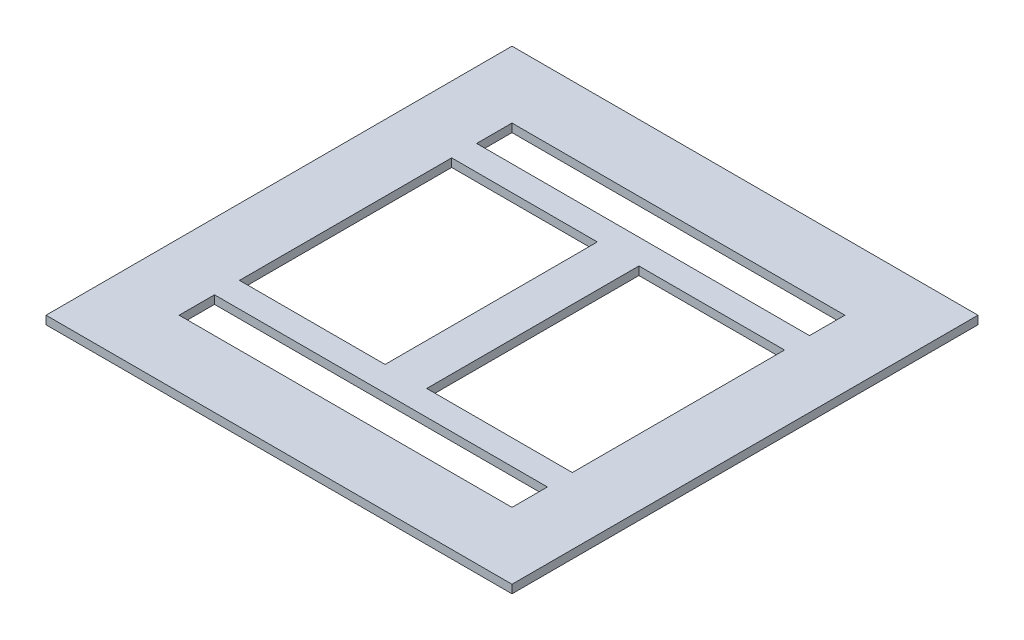
ISO-10303-21;
HEADER;
FILE_DESCRIPTION(('STEP AP214'),'2;1');
FILE_NAME('part.step','',(''),(''),'','','');
FILE_SCHEMA(('AUTOMOTIVE_DESIGN { 1 0 10303 214 1 1 1 1 }'));
ENDSEC;
DATA;
#1=APPLICATION_CONTEXT('core data for automotive mechanical design processes');
#2=APPLICATION_PROTOCOL_DEFINITION('international standard','automotive_design',2000,#1);
#3=PRODUCT_CONTEXT('',#1,'mechanical');
#4=PRODUCT('Part','Part','',(#3));
#5=PRODUCT_RELATED_PRODUCT_CATEGORY('part','',(#4));
#6=PRODUCT_DEFINITION_FORMATION('','',#4);
#7=PRODUCT_DEFINITION_CONTEXT('part definition',#1,'design');
#8=PRODUCT_DEFINITION('design','',#6,#7);
#9=PRODUCT_DEFINITION_SHAPE('','',#8);
#10=(LENGTH_UNIT() NAMED_UNIT(*) SI_UNIT(.MILLI.,.METRE.));
#11=(NAMED_UNIT(*) PLANE_ANGLE_UNIT() SI_UNIT($,.RADIAN.));
#12=(NAMED_UNIT(*) SI_UNIT($,.STERADIAN.) SOLID_ANGLE_UNIT());
#13=UNCERTAINTY_MEASURE_WITH_UNIT(LENGTH_MEASURE(1.E-05),#10,'distance_accuracy_value','');
#14=(GEOMETRIC_REPRESENTATION_CONTEXT(3) GLOBAL_UNCERTAINTY_ASSIGNED_CONTEXT((#13)) GLOBAL_UNIT_ASSIGNED_CONTEXT((#10,
#11,#12)) REPRESENTATION_CONTEXT('',''));
#15=CARTESIAN_POINT('',(0.,0.,0.));
#16=DIRECTION('',(0.,0.,1.));
#17=DIRECTION('',(1.,0.,0.));
#18=AXIS2_PLACEMENT_3D('',#15,#16,#17);
#19=CARTESIAN_POINT('',(0.,2.,0.));
#20=DIRECTION('',(0.,1.,0.));
#21=DIRECTION('',(0.,0.,1.));
#22=AXIS2_PLACEMENT_3D('',#19,#20,#21);
#23=PLANE('',#22);
#24=DIRECTION('',(0.,0.,1.));
#25=VECTOR('',#24,1.);
#26=CARTESIAN_POINT('',(-55.9999893418816,2.,-55.9999999999999));
#27=LINE('',#26,#25);
#28=CARTESIAN_POINT('',(-55.9999893418816,2.,-55.9999999999999));
#29=VERTEX_POINT('',#28);
#30=CARTESIAN_POINT('',(-55.9999893418816,2.,55.9999999999999));
#31=VERTEX_POINT('',#30);
#32=EDGE_CURVE('E299',#29,#31,#27,.T.);
#33=ORIENTED_EDGE('',*,*,#32,.T.);
#34=DIRECTION('',(1.,0.,0.));
#35=VECTOR('',#34,1.);
#36=CARTESIAN_POINT('',(-55.9999893418816,2.,55.9999999999999));
#37=LINE('',#36,#35);
#38=CARTESIAN_POINT('',(56.0000106581184,2.,55.9999999999999));
#39=VERTEX_POINT('',#38);
#40=EDGE_CURVE('E302',#31,#39,#37,.T.);
#41=ORIENTED_EDGE('',*,*,#40,.T.);
#42=DIRECTION('',(0.,0.,-1.));
#43=VECTOR('',#42,1.);
#44=CARTESIAN_POINT('',(56.0000106581184,2.,-55.9999999999999));
#45=LINE('',#44,#43);
#46=CARTESIAN_POINT('',(56.0000106581184,2.,-55.9999999999999));
#47=VERTEX_POINT('',#46);
#48=EDGE_CURVE('E305',#39,#47,#45,.T.);
#49=ORIENTED_EDGE('',*,*,#48,.T.);
#50=DIRECTION('',(-1.,0.,0.));
#51=VECTOR('',#50,1.);
#52=CARTESIAN_POINT('',(-55.9999893418816,2.,-55.9999999999999));
#53=LINE('',#52,#51);
#54=EDGE_CURVE('E307',#47,#29,#53,.T.);
#55=ORIENTED_EDGE('',*,*,#54,.T.);
#56=EDGE_LOOP('',(#33,#41,#49,#55));
#57=FACE_BOUND('',#56,.T.);
#58=DIRECTION('',(0.,0.,1.));
#59=VECTOR('',#58,1.);
#60=CARTESIAN_POINT('',(5.00001171600366,2.,-25.4999999999998));
#61=LINE('',#60,#59);
#62=CARTESIAN_POINT('',(5.00001171600366,2.,-25.4999999999998));
#63=VERTEX_POINT('',#62);
#64=CARTESIAN_POINT('',(5.00001171600367,2.,25.5000000000001));
#65=VERTEX_POINT('',#64);
#66=EDGE_CURVE('E270',#63,#65,#61,.T.);
#67=ORIENTED_EDGE('',*,*,#66,.F.);
#68=DIRECTION('',(-1.,0.,0.));
#69=VECTOR('',#68,1.);
#70=CARTESIAN_POINT('',(5.00001171600366,2.,-25.4999999999998));
#71=LINE('',#70,#69);
#72=CARTESIAN_POINT('',(40.0000117160037,2.,-25.4999999999998));
#73=VERTEX_POINT('',#72);
#74=EDGE_CURVE('E268',#73,#63,#71,.T.);
#75=ORIENTED_EDGE('',*,*,#74,.F.);
#76=DIRECTION('',(0.,0.,-1.));
#77=VECTOR('',#76,1.);
#78=CARTESIAN_POINT('',(40.0000117160037,2.,-25.4999999999998));
#79=LINE('',#78,#77);
#80=CARTESIAN_POINT('',(40.0000117160037,2.,25.5000000000001));
#81=VERTEX_POINT('',#80);
#82=EDGE_CURVE('E276',#81,#73,#79,.T.);
#83=ORIENTED_EDGE('',*,*,#82,.F.);
#84=DIRECTION('',(1.,0.,0.));
#85=VECTOR('',#84,1.);
#86=CARTESIAN_POINT('',(40.0000117160037,2.,25.5000000000001));
#87=LINE('',#86,#85);
#88=EDGE_CURVE('E273',#65,#81,#87,.T.);
#89=ORIENTED_EDGE('',*,*,#88,.F.);
#90=EDGE_LOOP('',(#67,#75,#83,#89));
#91=FACE_BOUND('',#90,.T.);
#92=DIRECTION('',(0.,0.,1.));
#93=VECTOR('',#92,1.);
#94=CARTESIAN_POINT('',(-39.9999882839963,2.,-25.4999999999998));
#95=LINE('',#94,#93);
#96=CARTESIAN_POINT('',(-39.9999882839963,2.,-25.4999999999998));
#97=VERTEX_POINT('',#96);
#98=CARTESIAN_POINT('',(-39.9999882839963,2.,25.5000000000002));
#99=VERTEX_POINT('',#98);
#100=EDGE_CURVE('E239',#97,#99,#95,.T.);
#101=ORIENTED_EDGE('',*,*,#100,.F.);
#102=DIRECTION('',(-1.,0.,0.));
#103=VECTOR('',#102,1.);
#104=CARTESIAN_POINT('',(-4.99998828399634,2.,-25.4999999999998));
#105=LINE('',#104,#103);
#106=CARTESIAN_POINT('',(-4.99998828399634,2.,-25.4999999999998));
#107=VERTEX_POINT('',#106);
#108=EDGE_CURVE('E237',#107,#97,#105,.T.);
#109=ORIENTED_EDGE('',*,*,#108,.F.);
#110=DIRECTION('',(0.,0.,-1.));
#111=VECTOR('',#110,1.);
#112=CARTESIAN_POINT('',(-4.99998828399634,2.,-25.4999999999998));
#113=LINE('',#112,#111);
#114=CARTESIAN_POINT('',(-4.99998828399634,2.,25.5000000000002));
#115=VERTEX_POINT('',#114);
#116=EDGE_CURVE('E245',#115,#107,#113,.T.);
#117=ORIENTED_EDGE('',*,*,#116,.F.);
#118=DIRECTION('',(1.,0.,0.));
#119=VECTOR('',#118,1.);
#120=CARTESIAN_POINT('',(-4.99998828399634,2.,25.5000000000002));
#121=LINE('',#120,#119);
#122=EDGE_CURVE('E242',#99,#115,#121,.T.);
#123=ORIENTED_EDGE('',*,*,#122,.F.);
#124=EDGE_LOOP('',(#101,#109,#117,#123));
#125=FACE_BOUND('',#124,.T.);
#126=DIRECTION('',(0.,0.,-1.));
#127=VECTOR('',#126,1.);
#128=CARTESIAN_POINT('',(40.0000016264633,2.,40.0000000000002));
#129=LINE('',#128,#127);
#130=CARTESIAN_POINT('',(40.0000016264633,2.,40.0000000000002));
#131=VERTEX_POINT('',#130);
#132=CARTESIAN_POINT('',(40.0000016264633,2.,31.5000000000002));
#133=VERTEX_POINT('',#132);
#134=EDGE_CURVE('E208',#131,#133,#129,.T.);
#135=ORIENTED_EDGE('',*,*,#134,.F.);
#136=DIRECTION('',(1.,0.,0.));
#137=VECTOR('',#136,1.);
#138=CARTESIAN_POINT('',(-39.9999882839963,2.,40.0000000000002));
#139=LINE('',#138,#137);
#140=CARTESIAN_POINT('',(-39.9999882839963,2.,40.0000000000002));
#141=VERTEX_POINT('',#140);
#142=EDGE_CURVE('E206',#141,#131,#139,.T.);
#143=ORIENTED_EDGE('',*,*,#142,.F.);
#144=DIRECTION('',(0.,0.,1.));
#145=VECTOR('',#144,1.);
#146=CARTESIAN_POINT('',(-39.9999882839963,2.,31.5000000000002));
#147=LINE('',#146,#145);
#148=CARTESIAN_POINT('',(-39.9999882839963,2.,31.5000000000002));
#149=VERTEX_POINT('',#148);
#150=EDGE_CURVE('E214',#149,#141,#147,.T.);
#151=ORIENTED_EDGE('',*,*,#150,.F.);
#152=DIRECTION('',(-1.,0.,0.));
#153=VECTOR('',#152,1.);
#154=CARTESIAN_POINT('',(-39.9999882839963,2.,31.5000000000002));
#155=LINE('',#154,#153);
#156=EDGE_CURVE('E211',#133,#149,#155,.T.);
#157=ORIENTED_EDGE('',*,*,#156,.F.);
#158=EDGE_LOOP('',(#135,#143,#151,#157));
#159=FACE_BOUND('',#158,.T.);
#160=DIRECTION('',(1.,0.,0.));
#161=VECTOR('',#160,1.);
#162=CARTESIAN_POINT('',(-39.999988283994,2.,-31.4999999999998));
#163=LINE('',#162,#161);
#164=CARTESIAN_POINT('',(-39.999988283994,2.,-31.4999999999998));
#165=VERTEX_POINT('',#164);
#166=CARTESIAN_POINT('',(40.0000016264633,2.,-31.4999999999998));
#167=VERTEX_POINT('',#166);
#168=EDGE_CURVE('E178',#165,#167,#163,.T.);
#169=ORIENTED_EDGE('',*,*,#168,.F.);
#170=DIRECTION('',(0.,0.,1.));
#171=VECTOR('',#170,1.);
#172=CARTESIAN_POINT('',(-39.999988283994,2.,-39.9999999999998));
#173=LINE('',#172,#171);
#174=CARTESIAN_POINT('',(-39.999988283994,2.,-39.9999999999998));
#175=VERTEX_POINT('',#174);
#176=EDGE_CURVE('E170',#175,#165,#173,.T.);
#177=ORIENTED_EDGE('',*,*,#176,.F.);
#178=DIRECTION('',(-1.,0.,0.));
#179=VECTOR('',#178,1.);
#180=CARTESIAN_POINT('',(40.0000016264633,2.,-39.9999999999999));
#181=LINE('',#180,#179);
#182=CARTESIAN_POINT('',(40.0000016264633,2.,-39.9999999999999));
#183=VERTEX_POINT('',#182);
#184=EDGE_CURVE('E192',#183,#175,#181,.T.);
#185=ORIENTED_EDGE('',*,*,#184,.F.);
#186=DIRECTION('',(0.,0.,-1.));
#187=VECTOR('',#186,1.);
#188=CARTESIAN_POINT('',(40.0000016264633,2.,-39.9999999999999));
#189=LINE('',#188,#187);
#190=EDGE_CURVE('E190',#167,#183,#189,.T.);
#191=ORIENTED_EDGE('',*,*,#190,.F.);
#192=EDGE_LOOP('',(#169,#177,#185,#191));
#193=FACE_BOUND('',#192,.T.);
#194=ADVANCED_FACE('F33',(#57,#91,#125,#159,#193),#23,.T.);
#195=CARTESIAN_POINT('',(0.,0.,0.));
#196=DIRECTION('',(0.,1.,0.));
#197=DIRECTION('',(0.,0.,1.));
#198=AXIS2_PLACEMENT_3D('',#195,#196,#197);
#199=PLANE('',#198);
#200=DIRECTION('',(1.,0.,0.));
#201=VECTOR('',#200,1.);
#202=CARTESIAN_POINT('',(-39.9999882839963,0.,40.0000000000002));
#203=LINE('',#202,#201);
#204=CARTESIAN_POINT('',(-39.9999882839963,0.,40.0000000000002));
#205=VERTEX_POINT('',#204);
#206=CARTESIAN_POINT('',(40.0000016264633,0.,40.0000000000002));
#207=VERTEX_POINT('',#206);
#208=EDGE_CURVE('E186',#205,#207,#203,.T.);
#209=ORIENTED_EDGE('',*,*,#208,.T.);
#210=DIRECTION('',(0.,0.,-1.));
#211=VECTOR('',#210,1.);
#212=CARTESIAN_POINT('',(40.0000016264633,0.,40.0000000000002));
#213=LINE('',#212,#211);
#214=CARTESIAN_POINT('',(40.0000016264633,0.,31.5000000000002));
#215=VERTEX_POINT('',#214);
#216=EDGE_CURVE('E219',#207,#215,#213,.T.);
#217=ORIENTED_EDGE('',*,*,#216,.T.);
#218=DIRECTION('',(-1.,0.,0.));
#219=VECTOR('',#218,1.);
#220=CARTESIAN_POINT('',(-39.9999882839963,0.,31.5000000000002));
#221=LINE('',#220,#219);
#222=CARTESIAN_POINT('',(-39.9999882839963,0.,31.5000000000002));
#223=VERTEX_POINT('',#222);
#224=EDGE_CURVE('E222',#215,#223,#221,.T.);
#225=ORIENTED_EDGE('',*,*,#224,.T.);
#226=DIRECTION('',(0.,0.,1.));
#227=VECTOR('',#226,1.);
#228=CARTESIAN_POINT('',(-39.9999882839963,0.,31.5000000000002));
#229=LINE('',#228,#227);
#230=EDGE_CURVE('E209',#223,#205,#229,.T.);
#231=ORIENTED_EDGE('',*,*,#230,.T.);
#232=EDGE_LOOP('',(#209,#217,#225,#231));
#233=FACE_BOUND('',#232,.T.);
#234=DIRECTION('',(-1.,0.,0.));
#235=VECTOR('',#234,1.);
#236=CARTESIAN_POINT('',(5.00001171600366,0.,-25.4999999999998));
#237=LINE('',#236,#235);
#238=CARTESIAN_POINT('',(40.0000117160037,0.,-25.4999999999998));
#239=VERTEX_POINT('',#238);
#240=CARTESIAN_POINT('',(5.00001171600366,0.,-25.4999999999998));
#241=VERTEX_POINT('',#240);
#242=EDGE_CURVE('E267',#239,#241,#237,.T.);
#243=ORIENTED_EDGE('',*,*,#242,.T.);
#244=DIRECTION('',(0.,0.,1.));
#245=VECTOR('',#244,1.);
#246=CARTESIAN_POINT('',(5.00001171600366,0.,-25.4999999999998));
#247=LINE('',#246,#245);
#248=CARTESIAN_POINT('',(5.00001171600367,0.,25.5000000000001));
#249=VERTEX_POINT('',#248);
#250=EDGE_CURVE('E281',#241,#249,#247,.T.);
#251=ORIENTED_EDGE('',*,*,#250,.T.);
#252=DIRECTION('',(1.,0.,0.));
#253=VECTOR('',#252,1.);
#254=CARTESIAN_POINT('',(40.0000117160037,0.,25.5000000000001));
#255=LINE('',#254,#253);
#256=CARTESIAN_POINT('',(40.0000117160037,0.,25.5000000000001));
#257=VERTEX_POINT('',#256);
#258=EDGE_CURVE('E284',#249,#257,#255,.T.);
#259=ORIENTED_EDGE('',*,*,#258,.T.);
#260=DIRECTION('',(0.,0.,-1.));
#261=VECTOR('',#260,1.);
#262=CARTESIAN_POINT('',(40.0000117160037,0.,-25.4999999999998));
#263=LINE('',#262,#261);
#264=EDGE_CURVE('E271',#257,#239,#263,.T.);
#265=ORIENTED_EDGE('',*,*,#264,.T.);
#266=EDGE_LOOP('',(#243,#251,#259,#265));
#267=FACE_BOUND('',#266,.T.);
#268=DIRECTION('',(0.,0.,1.));
#269=VECTOR('',#268,1.);
#270=CARTESIAN_POINT('',(-55.9999893418816,0.,-55.9999999999999));
#271=LINE('',#270,#269);
#272=CARTESIAN_POINT('',(-55.9999893418816,0.,-55.9999999999999));
#273=VERTEX_POINT('',#272);
#274=CARTESIAN_POINT('',(-55.9999893418816,0.,55.9999999999999));
#275=VERTEX_POINT('',#274);
#276=EDGE_CURVE('E298',#273,#275,#271,.T.);
#277=ORIENTED_EDGE('',*,*,#276,.F.);
#278=DIRECTION('',(-1.,0.,0.));
#279=VECTOR('',#278,1.);
#280=CARTESIAN_POINT('',(-55.9999893418816,0.,-55.9999999999999));
#281=LINE('',#280,#279);
#282=CARTESIAN_POINT('',(56.0000106581184,0.,-55.9999999999999));
#283=VERTEX_POINT('',#282);
#284=EDGE_CURVE('E303',#283,#273,#281,.T.);
#285=ORIENTED_EDGE('',*,*,#284,.F.);
#286=DIRECTION('',(0.,0.,-1.));
#287=VECTOR('',#286,1.);
#288=CARTESIAN_POINT('',(56.0000106581184,0.,-55.9999999999999));
#289=LINE('',#288,#287);
#290=CARTESIAN_POINT('',(56.0000106581184,0.,55.9999999999999));
#291=VERTEX_POINT('',#290);
#292=EDGE_CURVE('E314',#291,#283,#289,.T.);
#293=ORIENTED_EDGE('',*,*,#292,.F.);
#294=DIRECTION('',(1.,0.,0.));
#295=VECTOR('',#294,1.);
#296=CARTESIAN_POINT('',(-55.9999893418816,0.,55.9999999999999));
#297=LINE('',#296,#295);
#298=EDGE_CURVE('E312',#275,#291,#297,.T.);
#299=ORIENTED_EDGE('',*,*,#298,.F.);
#300=EDGE_LOOP('',(#277,#285,#293,#299));
#301=FACE_BOUND('',#300,.T.);
#302=DIRECTION('',(-1.,0.,0.));
#303=VECTOR('',#302,1.);
#304=CARTESIAN_POINT('',(-4.99998828399634,0.,-25.4999999999998));
#305=LINE('',#304,#303);
#306=CARTESIAN_POINT('',(-4.99998828399634,0.,-25.4999999999998));
#307=VERTEX_POINT('',#306);
#308=CARTESIAN_POINT('',(-39.9999882839963,0.,-25.4999999999998));
#309=VERTEX_POINT('',#308);
#310=EDGE_CURVE('E236',#307,#309,#305,.T.);
#311=ORIENTED_EDGE('',*,*,#310,.T.);
#312=DIRECTION('',(0.,0.,1.));
#313=VECTOR('',#312,1.);
#314=CARTESIAN_POINT('',(-39.9999882839963,0.,-25.4999999999998));
#315=LINE('',#314,#313);
#316=CARTESIAN_POINT('',(-39.9999882839963,0.,25.5000000000002));
#317=VERTEX_POINT('',#316);
#318=EDGE_CURVE('E250',#309,#317,#315,.T.);
#319=ORIENTED_EDGE('',*,*,#318,.T.);
#320=DIRECTION('',(1.,0.,0.));
#321=VECTOR('',#320,1.);
#322=CARTESIAN_POINT('',(-4.99998828399634,0.,25.5000000000002));
#323=LINE('',#322,#321);
#324=CARTESIAN_POINT('',(-4.99998828399634,0.,25.5000000000002));
#325=VERTEX_POINT('',#324);
#326=EDGE_CURVE('E253',#317,#325,#323,.T.);
#327=ORIENTED_EDGE('',*,*,#326,.T.);
#328=DIRECTION('',(0.,0.,-1.));
#329=VECTOR('',#328,1.);
#330=CARTESIAN_POINT('',(-4.99998828399634,0.,-25.4999999999998));
#331=LINE('',#330,#329);
#332=EDGE_CURVE('E240',#325,#307,#331,.T.);
#333=ORIENTED_EDGE('',*,*,#332,.T.);
#334=EDGE_LOOP('',(#311,#319,#327,#333));
#335=FACE_BOUND('',#334,.T.);
#336=DIRECTION('',(0.,0.,1.));
#337=VECTOR('',#336,1.);
#338=CARTESIAN_POINT('',(-39.999988283994,0.,-39.9999999999998));
#339=LINE('',#338,#337);
#340=CARTESIAN_POINT('',(-39.999988283994,0.,-39.9999999999998));
#341=VERTEX_POINT('',#340);
#342=CARTESIAN_POINT('',(-39.999988283994,0.,-31.4999999999998));
#343=VERTEX_POINT('',#342);
#344=EDGE_CURVE('E56',#341,#343,#339,.T.);
#345=ORIENTED_EDGE('',*,*,#344,.T.);
#346=DIRECTION('',(1.,0.,0.));
#347=VECTOR('',#346,1.);
#348=CARTESIAN_POINT('',(-39.999988283994,0.,-31.4999999999998));
#349=LINE('',#348,#347);
#350=CARTESIAN_POINT('',(40.0000016264633,0.,-31.4999999999998));
#351=VERTEX_POINT('',#350);
#352=EDGE_CURVE('E185',#343,#351,#349,.T.);
#353=ORIENTED_EDGE('',*,*,#352,.T.);
#354=DIRECTION('',(0.,0.,-1.));
#355=VECTOR('',#354,1.);
#356=CARTESIAN_POINT('',(40.0000016264633,0.,-39.9999999999999));
#357=LINE('',#356,#355);
#358=CARTESIAN_POINT('',(40.0000016264633,0.,-39.9999999999999));
#359=VERTEX_POINT('',#358);
#360=EDGE_CURVE('E198',#351,#359,#357,.T.);
#361=ORIENTED_EDGE('',*,*,#360,.T.);
#362=DIRECTION('',(-1.,0.,0.));
#363=VECTOR('',#362,1.);
#364=CARTESIAN_POINT('',(40.0000016264633,0.,-39.9999999999999));
#365=LINE('',#364,#363);
#366=EDGE_CURVE('E179',#359,#341,#365,.T.);
#367=ORIENTED_EDGE('',*,*,#366,.T.);
#368=EDGE_LOOP('',(#345,#353,#361,#367));
#369=FACE_BOUND('',#368,.T.);
#370=ADVANCED_FACE('F332',(#233,#267,#301,#335,#369),#199,.F.);
#371=CARTESIAN_POINT('',(-55.9999893418816,2.,-55.9999999999999));
#372=DIRECTION('',(1.,0.,0.));
#373=DIRECTION('',(0.,0.,-1.));
#374=AXIS2_PLACEMENT_3D('',#371,#372,#373);
#375=PLANE('',#374);
#376=ORIENTED_EDGE('',*,*,#276,.T.);
#377=DIRECTION('',(0.,-1.,0.));
#378=VECTOR('',#377,1.);
#379=CARTESIAN_POINT('',(-55.9999893418816,2.,55.9999999999999));
#380=LINE('',#379,#378);
#381=EDGE_CURVE('E11',#31,#275,#380,.T.);
#382=ORIENTED_EDGE('',*,*,#381,.F.);
#383=ORIENTED_EDGE('',*,*,#32,.F.);
#384=DIRECTION('',(0.,-1.,0.));
#385=VECTOR('',#384,1.);
#386=CARTESIAN_POINT('',(-55.9999893418816,2.,-55.9999999999999));
#387=LINE('',#386,#385);
#388=EDGE_CURVE('E309',#29,#273,#387,.T.);
#389=ORIENTED_EDGE('',*,*,#388,.T.);
#390=EDGE_LOOP('',(#376,#382,#383,#389));
#391=FACE_BOUND('',#390,.T.);
#392=ADVANCED_FACE('F35',(#391),#375,.F.);
#393=CARTESIAN_POINT('',(-55.9999893418816,2.,55.9999999999999));
#394=DIRECTION('',(0.,0.,-1.));
#395=DIRECTION('',(-1.,0.,0.));
#396=AXIS2_PLACEMENT_3D('',#393,#394,#395);
#397=PLANE('',#396);
#398=ORIENTED_EDGE('',*,*,#298,.T.);
#399=DIRECTION('',(0.,-1.,0.));
#400=VECTOR('',#399,1.);
#401=CARTESIAN_POINT('',(56.0000106581184,2.,55.9999999999999));
#402=LINE('',#401,#400);
#403=EDGE_CURVE('E41',#39,#291,#402,.T.);
#404=ORIENTED_EDGE('',*,*,#403,.F.);
#405=ORIENTED_EDGE('',*,*,#40,.F.);
#406=ORIENTED_EDGE('',*,*,#381,.T.);
#407=EDGE_LOOP('',(#398,#404,#405,#406));
#408=FACE_BOUND('',#407,.T.);
#409=ADVANCED_FACE('F343',(#408),#397,.F.);
#410=CARTESIAN_POINT('',(56.0000106581184,2.,-55.9999999999999));
#411=DIRECTION('',(-1.,0.,0.));
#412=DIRECTION('',(0.,0.,1.));
#413=AXIS2_PLACEMENT_3D('',#410,#411,#412);
#414=PLANE('',#413);
#415=ORIENTED_EDGE('',*,*,#292,.T.);
#416=DIRECTION('',(0.,-1.,0.));
#417=VECTOR('',#416,1.);
#418=CARTESIAN_POINT('',(56.0000106581184,2.,-55.9999999999999));
#419=LINE('',#418,#417);
#420=EDGE_CURVE('E319',#47,#283,#419,.T.);
#421=ORIENTED_EDGE('',*,*,#420,.F.);
#422=ORIENTED_EDGE('',*,*,#48,.F.);
#423=ORIENTED_EDGE('',*,*,#403,.T.);
#424=EDGE_LOOP('',(#415,#421,#422,#423));
#425=FACE_BOUND('',#424,.T.);
#426=ADVANCED_FACE('F326',(#425),#414,.F.);
#427=CARTESIAN_POINT('',(-55.9999893418816,2.,-55.9999999999999));
#428=DIRECTION('',(0.,0.,1.));
#429=DIRECTION('',(1.,0.,0.));
#430=AXIS2_PLACEMENT_3D('',#427,#428,#429);
#431=PLANE('',#430);
#432=ORIENTED_EDGE('',*,*,#284,.T.);
#433=ORIENTED_EDGE('',*,*,#388,.F.);
#434=ORIENTED_EDGE('',*,*,#54,.F.);
#435=ORIENTED_EDGE('',*,*,#420,.T.);
#436=EDGE_LOOP('',(#432,#433,#434,#435));
#437=FACE_BOUND('',#436,.T.);
#438=ADVANCED_FACE('F336',(#437),#431,.F.);
#439=CARTESIAN_POINT('',(5.00001171600366,2.,-25.4999999999998));
#440=DIRECTION('',(0.,0.,1.));
#441=DIRECTION('',(1.,0.,0.));
#442=AXIS2_PLACEMENT_3D('',#439,#440,#441);
#443=PLANE('',#442);
#444=ORIENTED_EDGE('',*,*,#242,.F.);
#445=DIRECTION('',(0.,-1.,0.));
#446=VECTOR('',#445,1.);
#447=CARTESIAN_POINT('',(40.0000117160037,2.,-25.4999999999998));
#448=LINE('',#447,#446);
#449=EDGE_CURVE('E278',#73,#239,#448,.T.);
#450=ORIENTED_EDGE('',*,*,#449,.F.);
#451=ORIENTED_EDGE('',*,*,#74,.T.);
#452=DIRECTION('',(0.,-1.,0.));
#453=VECTOR('',#452,1.);
#454=CARTESIAN_POINT('',(5.00001171600366,2.,-25.4999999999998));
#455=LINE('',#454,#453);
#456=EDGE_CURVE('E295',#63,#241,#455,.T.);
#457=ORIENTED_EDGE('',*,*,#456,.T.);
#458=EDGE_LOOP('',(#444,#450,#451,#457));
#459=FACE_BOUND('',#458,.T.);
#460=ADVANCED_FACE('F358',(#459),#443,.T.);
#461=CARTESIAN_POINT('',(5.00001171600366,2.,-25.4999999999998));
#462=DIRECTION('',(1.,0.,0.));
#463=DIRECTION('',(0.,0.,-1.));
#464=AXIS2_PLACEMENT_3D('',#461,#462,#463);
#465=PLANE('',#464);
#466=ORIENTED_EDGE('',*,*,#250,.F.);
#467=ORIENTED_EDGE('',*,*,#456,.F.);
#468=ORIENTED_EDGE('',*,*,#66,.T.);
#469=DIRECTION('',(0.,-1.,0.));
#470=VECTOR('',#469,1.);
#471=CARTESIAN_POINT('',(5.00001171600367,2.,25.5000000000001));
#472=LINE('',#471,#470);
#473=EDGE_CURVE('E293',#65,#249,#472,.T.);
#474=ORIENTED_EDGE('',*,*,#473,.T.);
#475=EDGE_LOOP('',(#466,#467,#468,#474));
#476=FACE_BOUND('',#475,.T.);
#477=ADVANCED_FACE('F365',(#476),#465,.T.);
#478=CARTESIAN_POINT('',(40.0000117160037,2.,25.5000000000001));
#479=DIRECTION('',(0.,0.,-1.));
#480=DIRECTION('',(-1.,0.,0.));
#481=AXIS2_PLACEMENT_3D('',#478,#479,#480);
#482=PLANE('',#481);
#483=ORIENTED_EDGE('',*,*,#258,.F.);
#484=ORIENTED_EDGE('',*,*,#473,.F.);
#485=ORIENTED_EDGE('',*,*,#88,.T.);
#486=DIRECTION('',(0.,-1.,0.));
#487=VECTOR('',#486,1.);
#488=CARTESIAN_POINT('',(40.0000117160037,2.,25.5000000000001));
#489=LINE('',#488,#487);
#490=EDGE_CURVE('E291',#81,#257,#489,.T.);
#491=ORIENTED_EDGE('',*,*,#490,.T.);
#492=EDGE_LOOP('',(#483,#484,#485,#491));
#493=FACE_BOUND('',#492,.T.);
#494=ADVANCED_FACE('F370',(#493),#482,.T.);
#495=CARTESIAN_POINT('',(40.0000117160037,2.,-25.4999999999998));
#496=DIRECTION('',(-1.,0.,0.));
#497=DIRECTION('',(0.,0.,1.));
#498=AXIS2_PLACEMENT_3D('',#495,#496,#497);
#499=PLANE('',#498);
#500=ORIENTED_EDGE('',*,*,#264,.F.);
#501=ORIENTED_EDGE('',*,*,#490,.F.);
#502=ORIENTED_EDGE('',*,*,#82,.T.);
#503=ORIENTED_EDGE('',*,*,#449,.T.);
#504=EDGE_LOOP('',(#500,#501,#502,#503));
#505=FACE_BOUND('',#504,.T.);
#506=ADVANCED_FACE('F378',(#505),#499,.T.);
#507=CARTESIAN_POINT('',(-4.99998828399634,2.,-25.4999999999998));
#508=DIRECTION('',(0.,0.,1.));
#509=DIRECTION('',(1.,0.,0.));
#510=AXIS2_PLACEMENT_3D('',#507,#508,#509);
#511=PLANE('',#510);
#512=ORIENTED_EDGE('',*,*,#310,.F.);
#513=DIRECTION('',(0.,-1.,0.));
#514=VECTOR('',#513,1.);
#515=CARTESIAN_POINT('',(-4.99998828399634,2.,-25.4999999999998));
#516=LINE('',#515,#514);
#517=EDGE_CURVE('E247',#107,#307,#516,.T.);
#518=ORIENTED_EDGE('',*,*,#517,.F.);
#519=ORIENTED_EDGE('',*,*,#108,.T.);
#520=DIRECTION('',(0.,-1.,0.));
#521=VECTOR('',#520,1.);
#522=CARTESIAN_POINT('',(-39.9999882839963,2.,-25.4999999999998));
#523=LINE('',#522,#521);
#524=EDGE_CURVE('E264',#97,#309,#523,.T.);
#525=ORIENTED_EDGE('',*,*,#524,.T.);
#526=EDGE_LOOP('',(#512,#518,#519,#525));
#527=FACE_BOUND('',#526,.T.);
#528=ADVANCED_FACE('F432',(#527),#511,.T.);
#529=CARTESIAN_POINT('',(-39.9999882839963,2.,-25.4999999999998));
#530=DIRECTION('',(1.,0.,0.));
#531=DIRECTION('',(0.,0.,-1.));
#532=AXIS2_PLACEMENT_3D('',#529,#530,#531);
#533=PLANE('',#532);
#534=ORIENTED_EDGE('',*,*,#318,.F.);
#535=ORIENTED_EDGE('',*,*,#524,.F.);
#536=ORIENTED_EDGE('',*,*,#100,.T.);
#537=DIRECTION('',(0.,-1.,0.));
#538=VECTOR('',#537,1.);
#539=CARTESIAN_POINT('',(-39.9999882839963,2.,25.5000000000002));
#540=LINE('',#539,#538);
#541=EDGE_CURVE('E262',#99,#317,#540,.T.);
#542=ORIENTED_EDGE('',*,*,#541,.T.);
#543=EDGE_LOOP('',(#534,#535,#536,#542));
#544=FACE_BOUND('',#543,.T.);
#545=ADVANCED_FACE('F428',(#544),#533,.T.);
#546=CARTESIAN_POINT('',(-4.99998828399634,2.,25.5000000000002));
#547=DIRECTION('',(0.,0.,-1.));
#548=DIRECTION('',(-1.,0.,0.));
#549=AXIS2_PLACEMENT_3D('',#546,#547,#548);
#550=PLANE('',#549);
#551=ORIENTED_EDGE('',*,*,#326,.F.);
#552=ORIENTED_EDGE('',*,*,#541,.F.);
#553=ORIENTED_EDGE('',*,*,#122,.T.);
#554=DIRECTION('',(0.,-1.,0.));
#555=VECTOR('',#554,1.);
#556=CARTESIAN_POINT('',(-4.99998828399634,2.,25.5000000000002));
#557=LINE('',#556,#555);
#558=EDGE_CURVE('E260',#115,#325,#557,.T.);
#559=ORIENTED_EDGE('',*,*,#558,.T.);
#560=EDGE_LOOP('',(#551,#552,#553,#559));
#561=FACE_BOUND('',#560,.T.);
#562=ADVANCED_FACE('F424',(#561),#550,.T.);
#563=CARTESIAN_POINT('',(-4.99998828399634,2.,-25.4999999999998));
#564=DIRECTION('',(-1.,0.,0.));
#565=DIRECTION('',(0.,0.,1.));
#566=AXIS2_PLACEMENT_3D('',#563,#564,#565);
#567=PLANE('',#566);
#568=ORIENTED_EDGE('',*,*,#332,.F.);
#569=ORIENTED_EDGE('',*,*,#558,.F.);
#570=ORIENTED_EDGE('',*,*,#116,.T.);
#571=ORIENTED_EDGE('',*,*,#517,.T.);
#572=EDGE_LOOP('',(#568,#569,#570,#571));
#573=FACE_BOUND('',#572,.T.);
#574=ADVANCED_FACE('F421',(#573),#567,.T.);
#575=CARTESIAN_POINT('',(-39.9999882839963,2.,40.0000000000002));
#576=DIRECTION('',(0.,0.,-1.));
#577=DIRECTION('',(-1.,0.,0.));
#578=AXIS2_PLACEMENT_3D('',#575,#576,#577);
#579=PLANE('',#578);
#580=ORIENTED_EDGE('',*,*,#208,.F.);
#581=DIRECTION('',(0.,-1.,0.));
#582=VECTOR('',#581,1.);
#583=CARTESIAN_POINT('',(-39.9999882839963,2.,40.0000000000002));
#584=LINE('',#583,#582);
#585=EDGE_CURVE('E216',#141,#205,#584,.T.);
#586=ORIENTED_EDGE('',*,*,#585,.F.);
#587=ORIENTED_EDGE('',*,*,#142,.T.);
#588=DIRECTION('',(0.,-1.,0.));
#589=VECTOR('',#588,1.);
#590=CARTESIAN_POINT('',(40.0000016264633,2.,40.0000000000002));
#591=LINE('',#590,#589);
#592=EDGE_CURVE('E233',#131,#207,#591,.T.);
#593=ORIENTED_EDGE('',*,*,#592,.T.);
#594=EDGE_LOOP('',(#580,#586,#587,#593));
#595=FACE_BOUND('',#594,.T.);
#596=ADVANCED_FACE('F403',(#595),#579,.T.);
#597=CARTESIAN_POINT('',(40.0000016264633,2.,40.0000000000002));
#598=DIRECTION('',(-1.,0.,0.));
#599=DIRECTION('',(0.,0.,1.));
#600=AXIS2_PLACEMENT_3D('',#597,#598,#599);
#601=PLANE('',#600);
#602=ORIENTED_EDGE('',*,*,#216,.F.);
#603=ORIENTED_EDGE('',*,*,#592,.F.);
#604=ORIENTED_EDGE('',*,*,#134,.T.);
#605=DIRECTION('',(0.,-1.,0.));
#606=VECTOR('',#605,1.);
#607=CARTESIAN_POINT('',(40.0000016264633,2.,31.5000000000002));
#608=LINE('',#607,#606);
#609=EDGE_CURVE('E231',#133,#215,#608,.T.);
#610=ORIENTED_EDGE('',*,*,#609,.T.);
#611=EDGE_LOOP('',(#602,#603,#604,#610));
#612=FACE_BOUND('',#611,.T.);
#613=ADVANCED_FACE('F397',(#612),#601,.T.);
#614=CARTESIAN_POINT('',(-39.9999882839963,2.,31.5000000000002));
#615=DIRECTION('',(0.,0.,1.));
#616=DIRECTION('',(1.,0.,0.));
#617=AXIS2_PLACEMENT_3D('',#614,#615,#616);
#618=PLANE('',#617);
#619=ORIENTED_EDGE('',*,*,#224,.F.);
#620=ORIENTED_EDGE('',*,*,#609,.F.);
#621=ORIENTED_EDGE('',*,*,#156,.T.);
#622=DIRECTION('',(0.,-1.,0.));
#623=VECTOR('',#622,1.);
#624=CARTESIAN_POINT('',(-39.9999882839963,2.,31.5000000000002));
#625=LINE('',#624,#623);
#626=EDGE_CURVE('E229',#149,#223,#625,.T.);
#627=ORIENTED_EDGE('',*,*,#626,.T.);
#628=EDGE_LOOP('',(#619,#620,#621,#627));
#629=FACE_BOUND('',#628,.T.);
#630=ADVANCED_FACE('F400',(#629),#618,.T.);
#631=CARTESIAN_POINT('',(-39.9999882839963,2.,31.5000000000002));
#632=DIRECTION('',(1.,0.,0.));
#633=DIRECTION('',(0.,0.,-1.));
#634=AXIS2_PLACEMENT_3D('',#631,#632,#633);
#635=PLANE('',#634);
#636=ORIENTED_EDGE('',*,*,#230,.F.);
#637=ORIENTED_EDGE('',*,*,#626,.F.);
#638=ORIENTED_EDGE('',*,*,#150,.T.);
#639=ORIENTED_EDGE('',*,*,#585,.T.);
#640=EDGE_LOOP('',(#636,#637,#638,#639));
#641=FACE_BOUND('',#640,.T.);
#642=ADVANCED_FACE('F406',(#641),#635,.T.);
#643=CARTESIAN_POINT('',(-39.999988283994,2.,-39.9999999999998));
#644=DIRECTION('',(1.,0.,0.));
#645=DIRECTION('',(0.,0.,-1.));
#646=AXIS2_PLACEMENT_3D('',#643,#644,#645);
#647=PLANE('',#646);
#648=ORIENTED_EDGE('',*,*,#344,.F.);
#649=DIRECTION('',(0.,-1.,0.));
#650=VECTOR('',#649,1.);
#651=CARTESIAN_POINT('',(-39.999988283994,2.,-39.9999999999998));
#652=LINE('',#651,#650);
#653=EDGE_CURVE('E174',#175,#341,#652,.T.);
#654=ORIENTED_EDGE('',*,*,#653,.F.);
#655=ORIENTED_EDGE('',*,*,#176,.T.);
#656=DIRECTION('',(0.,-1.,0.));
#657=VECTOR('',#656,1.);
#658=CARTESIAN_POINT('',(-39.999988283994,2.,-31.4999999999998));
#659=LINE('',#658,#657);
#660=EDGE_CURVE('E173',#165,#343,#659,.T.);
#661=ORIENTED_EDGE('',*,*,#660,.T.);
#662=EDGE_LOOP('',(#648,#654,#655,#661));
#663=FACE_BOUND('',#662,.T.);
#664=ADVANCED_FACE('F172',(#663),#647,.T.);
#665=CARTESIAN_POINT('',(-39.999988283994,2.,-31.4999999999998));
#666=DIRECTION('',(0.,0.,-1.));
#667=DIRECTION('',(-1.,0.,0.));
#668=AXIS2_PLACEMENT_3D('',#665,#666,#667);
#669=PLANE('',#668);
#670=ORIENTED_EDGE('',*,*,#352,.F.);
#671=ORIENTED_EDGE('',*,*,#660,.F.);
#672=ORIENTED_EDGE('',*,*,#168,.T.);
#673=DIRECTION('',(0.,-1.,0.));
#674=VECTOR('',#673,1.);
#675=CARTESIAN_POINT('',(40.0000016264633,2.,-31.4999999999998));
#676=LINE('',#675,#674);
#677=EDGE_CURVE('E187',#167,#351,#676,.T.);
#678=ORIENTED_EDGE('',*,*,#677,.T.);
#679=EDGE_LOOP('',(#670,#671,#672,#678));
#680=FACE_BOUND('',#679,.T.);
#681=ADVANCED_FACE('F182',(#680),#669,.T.);
#682=CARTESIAN_POINT('',(40.0000016264633,2.,-39.9999999999999));
#683=DIRECTION('',(-1.,0.,0.));
#684=DIRECTION('',(0.,0.,1.));
#685=AXIS2_PLACEMENT_3D('',#682,#683,#684);
#686=PLANE('',#685);
#687=ORIENTED_EDGE('',*,*,#360,.F.);
#688=ORIENTED_EDGE('',*,*,#677,.F.);
#689=ORIENTED_EDGE('',*,*,#190,.T.);
#690=DIRECTION('',(0.,-1.,0.));
#691=VECTOR('',#690,1.);
#692=CARTESIAN_POINT('',(40.0000016264633,2.,-39.9999999999999));
#693=LINE('',#692,#691);
#694=EDGE_CURVE('E48',#183,#359,#693,.T.);
#695=ORIENTED_EDGE('',*,*,#694,.T.);
#696=EDGE_LOOP('',(#687,#688,#689,#695));
#697=FACE_BOUND('',#696,.T.);
#698=ADVANCED_FACE('F495',(#697),#686,.T.);
#699=CARTESIAN_POINT('',(40.0000016264633,2.,-39.9999999999999));
#700=DIRECTION('',(0.,0.,1.));
#701=DIRECTION('',(1.,0.,0.));
#702=AXIS2_PLACEMENT_3D('',#699,#700,#701);
#703=PLANE('',#702);
#704=ORIENTED_EDGE('',*,*,#366,.F.);
#705=ORIENTED_EDGE('',*,*,#694,.F.);
#706=ORIENTED_EDGE('',*,*,#184,.T.);
#707=ORIENTED_EDGE('',*,*,#653,.T.);
#708=EDGE_LOOP('',(#704,#705,#706,#707));
#709=FACE_BOUND('',#708,.T.);
#710=ADVANCED_FACE('F503',(#709),#703,.T.);
#711=CLOSED_SHELL('',(#194,#370,#392,#409,#426,#438,#460,#477,#494,#506,#528,#545,#562,#574,
#596,#613,#630,#642,#664,#681,#698,#710));
#712=MANIFOLD_SOLID_BREP('B2',#711);
#713=ADVANCED_BREP_SHAPE_REPRESENTATION('',(#18,#712),#14);
#714=SHAPE_DEFINITION_REPRESENTATION(#9,#713);
ENDSEC;
END-ISO-10303-21;
